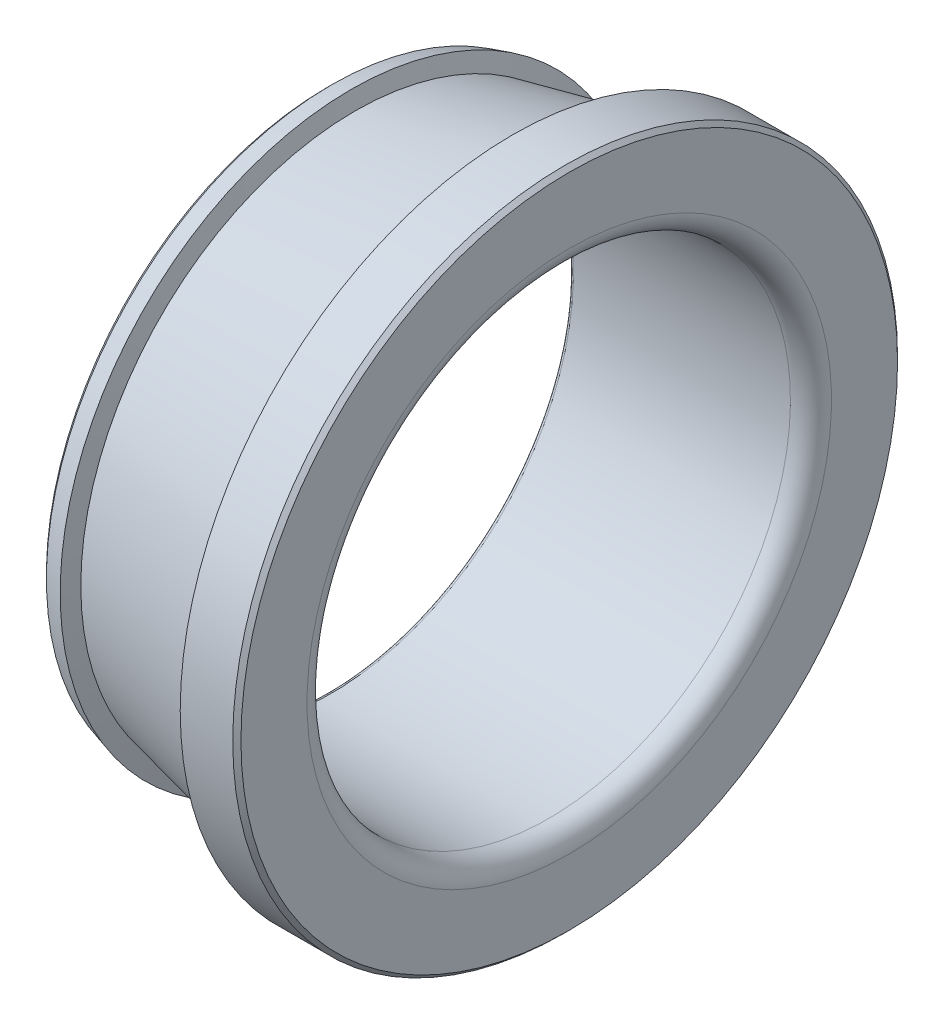
ISO-10303-21;
HEADER;
FILE_DESCRIPTION(('STEP AP214'),'2;1');
FILE_NAME('part.step','',(''),(''),'','','');
FILE_SCHEMA(('AUTOMOTIVE_DESIGN { 1 0 10303 214 1 1 1 1 }'));
ENDSEC;
DATA;
#1=APPLICATION_CONTEXT('core data for automotive mechanical design processes');
#2=APPLICATION_PROTOCOL_DEFINITION('international standard','automotive_design',2000,#1);
#3=PRODUCT_CONTEXT('',#1,'mechanical');
#4=PRODUCT('Part','Part','',(#3));
#5=PRODUCT_RELATED_PRODUCT_CATEGORY('part','',(#4));
#6=PRODUCT_DEFINITION_FORMATION('','',#4);
#7=PRODUCT_DEFINITION_CONTEXT('part definition',#1,'design');
#8=PRODUCT_DEFINITION('design','',#6,#7);
#9=PRODUCT_DEFINITION_SHAPE('','',#8);
#10=(LENGTH_UNIT() NAMED_UNIT(*) SI_UNIT(.MILLI.,.METRE.));
#11=(NAMED_UNIT(*) PLANE_ANGLE_UNIT() SI_UNIT($,.RADIAN.));
#12=(NAMED_UNIT(*) SI_UNIT($,.STERADIAN.) SOLID_ANGLE_UNIT());
#13=UNCERTAINTY_MEASURE_WITH_UNIT(LENGTH_MEASURE(1.E-05),#10,'distance_accuracy_value','');
#14=(GEOMETRIC_REPRESENTATION_CONTEXT(3) GLOBAL_UNCERTAINTY_ASSIGNED_CONTEXT((#13)) GLOBAL_UNIT_ASSIGNED_CONTEXT((#10,
#11,#12)) REPRESENTATION_CONTEXT('',''));
#15=CARTESIAN_POINT('',(0.,0.,0.));
#16=DIRECTION('',(0.,0.,1.));
#17=DIRECTION('',(1.,0.,0.));
#18=AXIS2_PLACEMENT_3D('',#15,#16,#17);
#19=CARTESIAN_POINT('',(14.6375,0.,0.));
#20=DIRECTION('',(1.,0.,0.));
#21=DIRECTION('',(0.,1.,0.));
#22=AXIS2_PLACEMENT_3D('',#19,#20,#21);
#23=CONICAL_SURFACE('',#22,52.72875,0.281388552797828);
#24=CARTESIAN_POINT('',(0.7,0.,0.));
#25=DIRECTION('',(1.,0.,0.));
#26=DIRECTION('',(0.,1.,0.));
#27=AXIS2_PLACEMENT_3D('',#24,#25,#26);
#28=CIRCLE('',#27,48.7);
#29=CARTESIAN_POINT('',(0.7,48.7,0.));
#30=VERTEX_POINT('',#29);
#31=EDGE_CURVE('E11',#30,#30,#28,.T.);
#32=ORIENTED_EDGE('',*,*,#31,.T.);
#33=EDGE_LOOP('',(#32));
#34=FACE_BOUND('',#33,.T.);
#35=CARTESIAN_POINT('',(4.00126844537017,0.,0.));
#36=DIRECTION('',(-1.,0.,0.));
#37=DIRECTION('',(0.,1.,0.));
#38=AXIS2_PLACEMENT_3D('',#35,#36,#37);
#39=CIRCLE('',#38,49.6542590313389);
#40=CARTESIAN_POINT('',(4.00126844537017,-49.6542590313389,0.));
#41=VERTEX_POINT('',#40);
#42=EDGE_CURVE('E44',#41,#41,#39,.T.);
#43=ORIENTED_EDGE('',*,*,#42,.T.);
#44=EDGE_LOOP('',(#43));
#45=FACE_BOUND('',#44,.T.);
#46=ADVANCED_FACE('F17',(#34,#45),#23,.T.);
#47=CARTESIAN_POINT('',(0.35,0.,0.));
#48=DIRECTION('',(1.,0.,0.));
#49=DIRECTION('',(0.,1.,0.));
#50=AXIS2_PLACEMENT_3D('',#47,#48,#49);
#51=CONICAL_SURFACE('',#50,48.35,0.78539816339745);
#52=CARTESIAN_POINT('',(0.,0.,0.));
#53=DIRECTION('',(1.,0.,0.));
#54=DIRECTION('',(0.,1.,0.));
#55=AXIS2_PLACEMENT_3D('',#52,#53,#54);
#56=CIRCLE('',#55,48.);
#57=CARTESIAN_POINT('',(0.,48.,0.));
#58=VERTEX_POINT('',#57);
#59=EDGE_CURVE('E26',#58,#58,#56,.T.);
#60=ORIENTED_EDGE('',*,*,#59,.T.);
#61=EDGE_LOOP('',(#60));
#62=FACE_BOUND('',#61,.T.);
#63=ORIENTED_EDGE('',*,*,#31,.F.);
#64=EDGE_LOOP('',(#63));
#65=FACE_BOUND('',#64,.T.);
#66=ADVANCED_FACE('F112',(#62,#65),#51,.T.);
#67=CARTESIAN_POINT('',(0.,44.9875,0.));
#68=DIRECTION('',(-1.,0.,0.));
#69=DIRECTION('',(0.,-1.,0.));
#70=AXIS2_PLACEMENT_3D('',#67,#68,#69);
#71=PLANE('',#70);
#72=CARTESIAN_POINT('',(0.,0.,0.));
#73=DIRECTION('',(1.,0.,0.));
#74=DIRECTION('',(0.,1.,0.));
#75=AXIS2_PLACEMENT_3D('',#72,#73,#74);
#76=CIRCLE('',#75,41.975);
#77=CARTESIAN_POINT('',(0.,41.975,0.));
#78=VERTEX_POINT('',#77);
#79=EDGE_CURVE('E76',#78,#78,#76,.T.);
#80=ORIENTED_EDGE('',*,*,#79,.T.);
#81=EDGE_LOOP('',(#80));
#82=FACE_BOUND('',#81,.T.);
#83=ORIENTED_EDGE('',*,*,#59,.F.);
#84=EDGE_LOOP('',(#83));
#85=FACE_BOUND('',#84,.T.);
#86=ADVANCED_FACE('F116',(#82,#85),#71,.T.);
#87=CARTESIAN_POINT('',(0.7,0.,0.));
#88=DIRECTION('',(1.,0.,0.));
#89=DIRECTION('',(0.,0.,-1.));
#90=AXIS2_PLACEMENT_3D('',#87,#88,#89);
#91=TOROIDAL_SURFACE('',#90,41.975,0.7);
#92=CARTESIAN_POINT('',(0.7,0.,0.));
#93=DIRECTION('',(1.,0.,0.));
#94=DIRECTION('',(0.,1.,0.));
#95=AXIS2_PLACEMENT_3D('',#92,#93,#94);
#96=CIRCLE('',#95,41.275);
#97=CARTESIAN_POINT('',(0.7,41.275,0.));
#98=VERTEX_POINT('',#97);
#99=EDGE_CURVE('E67',#98,#98,#96,.T.);
#100=ORIENTED_EDGE('',*,*,#99,.T.);
#101=EDGE_LOOP('',(#100));
#102=FACE_BOUND('',#101,.T.);
#103=ORIENTED_EDGE('',*,*,#79,.F.);
#104=EDGE_LOOP('',(#103));
#105=FACE_BOUND('',#104,.T.);
#106=ADVANCED_FACE('F122',(#102,#105),#91,.T.);
#107=CARTESIAN_POINT('',(19.2375,0.,0.));
#108=DIRECTION('',(-1.,0.,0.));
#109=DIRECTION('',(0.,1.,0.));
#110=AXIS2_PLACEMENT_3D('',#107,#108,#109);
#111=CYLINDRICAL_SURFACE('',#110,41.275);
#112=CARTESIAN_POINT('',(37.775,0.,0.));
#113=DIRECTION('',(1.,0.,0.));
#114=DIRECTION('',(0.,1.,0.));
#115=AXIS2_PLACEMENT_3D('',#112,#113,#114);
#116=CIRCLE('',#115,41.275);
#117=CARTESIAN_POINT('',(37.775,41.275,0.));
#118=VERTEX_POINT('',#117);
#119=EDGE_CURVE('E71',#118,#118,#116,.T.);
#120=ORIENTED_EDGE('',*,*,#119,.T.);
#121=EDGE_LOOP('',(#120));
#122=FACE_BOUND('',#121,.T.);
#123=ORIENTED_EDGE('',*,*,#99,.F.);
#124=EDGE_LOOP('',(#123));
#125=FACE_BOUND('',#124,.T.);
#126=ADVANCED_FACE('F72',(#122,#125),#111,.F.);
#127=CARTESIAN_POINT('',(37.775,0.,0.));
#128=DIRECTION('',(1.,0.,0.));
#129=DIRECTION('',(0.,0.,-1.));
#130=AXIS2_PLACEMENT_3D('',#127,#128,#129);
#131=TOROIDAL_SURFACE('',#130,44.775,3.5);
#132=CARTESIAN_POINT('',(41.275,0.,0.));
#133=DIRECTION('',(1.,0.,0.));
#134=DIRECTION('',(0.,1.,0.));
#135=AXIS2_PLACEMENT_3D('',#132,#133,#134);
#136=CIRCLE('',#135,44.775);
#137=CARTESIAN_POINT('',(41.275,44.775,0.));
#138=VERTEX_POINT('',#137);
#139=EDGE_CURVE('E75',#138,#138,#136,.T.);
#140=ORIENTED_EDGE('',*,*,#139,.T.);
#141=EDGE_LOOP('',(#140));
#142=FACE_BOUND('',#141,.T.);
#143=ORIENTED_EDGE('',*,*,#119,.F.);
#144=EDGE_LOOP('',(#143));
#145=FACE_BOUND('',#144,.T.);
#146=ADVANCED_FACE('F108',(#142,#145),#131,.T.);
#147=CARTESIAN_POINT('',(41.275,50.41625,0.));
#148=DIRECTION('',(1.,0.,0.));
#149=DIRECTION('',(0.,1.,0.));
#150=AXIS2_PLACEMENT_3D('',#147,#148,#149);
#151=PLANE('',#150);
#152=CARTESIAN_POINT('',(41.275,0.,0.));
#153=DIRECTION('',(1.,0.,0.));
#154=DIRECTION('',(0.,1.,0.));
#155=AXIS2_PLACEMENT_3D('',#152,#153,#154);
#156=CIRCLE('',#155,56.0575);
#157=CARTESIAN_POINT('',(41.275,56.0575,0.));
#158=VERTEX_POINT('',#157);
#159=EDGE_CURVE('E78',#158,#158,#156,.T.);
#160=ORIENTED_EDGE('',*,*,#159,.T.);
#161=EDGE_LOOP('',(#160));
#162=FACE_BOUND('',#161,.T.);
#163=ORIENTED_EDGE('',*,*,#139,.F.);
#164=EDGE_LOOP('',(#163));
#165=FACE_BOUND('',#164,.T.);
#166=ADVANCED_FACE('F92',(#162,#165),#151,.T.);
#167=CARTESIAN_POINT('',(40.925,0.,0.));
#168=DIRECTION('',(-1.,0.,0.));
#169=DIRECTION('',(0.,1.,0.));
#170=AXIS2_PLACEMENT_3D('',#167,#168,#169);
#171=CONICAL_SURFACE('',#170,56.4075,0.785398163397448);
#172=CARTESIAN_POINT('',(40.575,0.,0.));
#173=DIRECTION('',(1.,0.,0.));
#174=DIRECTION('',(0.,1.,0.));
#175=AXIS2_PLACEMENT_3D('',#172,#173,#174);
#176=CIRCLE('',#175,56.7575);
#177=CARTESIAN_POINT('',(40.575,56.7575,0.));
#178=VERTEX_POINT('',#177);
#179=EDGE_CURVE('E84',#178,#178,#176,.T.);
#180=ORIENTED_EDGE('',*,*,#179,.T.);
#181=EDGE_LOOP('',(#180));
#182=FACE_BOUND('',#181,.T.);
#183=ORIENTED_EDGE('',*,*,#159,.F.);
#184=EDGE_LOOP('',(#183));
#185=FACE_BOUND('',#184,.T.);
#186=ADVANCED_FACE('F95',(#182,#185),#171,.T.);
#187=CARTESIAN_POINT('',(34.575,0.,0.));
#188=DIRECTION('',(-1.,0.,0.));
#189=DIRECTION('',(0.,1.,0.));
#190=AXIS2_PLACEMENT_3D('',#187,#188,#189);
#191=CYLINDRICAL_SURFACE('',#190,56.7575);
#192=ORIENTED_EDGE('',*,*,#179,.F.);
#193=EDGE_LOOP('',(#192));
#194=FACE_BOUND('',#193,.T.);
#195=CARTESIAN_POINT('',(31.6041194259764,0.,0.));
#196=DIRECTION('',(1.,0.,0.));
#197=DIRECTION('',(0.,1.,0.));
#198=AXIS2_PLACEMENT_3D('',#195,#196,#197);
#199=CIRCLE('',#198,56.7575);
#200=CARTESIAN_POINT('',(31.6041194259764,-56.7575,0.));
#201=VERTEX_POINT('',#200);
#202=EDGE_CURVE('E82',#201,#201,#199,.T.);
#203=ORIENTED_EDGE('',*,*,#202,.T.);
#204=EDGE_LOOP('',(#203));
#205=FACE_BOUND('',#204,.T.);
#206=ADVANCED_FACE('F97',(#194,#205),#191,.T.);
#207=CARTESIAN_POINT('',(30.6762706178788,0.,0.));
#208=DIRECTION('',(-1.,0.,0.));
#209=DIRECTION('',(0.,1.,0.));
#210=AXIS2_PLACEMENT_3D('',#207,#208,#209);
#211=CONICAL_SURFACE('',#210,60.5564840953873,1.33124988695867);
#212=CARTESIAN_POINT('',(32.5597753365617,0.,0.));
#213=DIRECTION('',(1.,0.,0.));
#214=DIRECTION('',(0.,1.,0.));
#215=AXIS2_PLACEMENT_3D('',#212,#213,#214);
#216=CIRCLE('',#215,52.8446625061194);
#217=CARTESIAN_POINT('',(32.5597753365617,52.8446625061194,0.));
#218=VERTEX_POINT('',#217);
#219=EDGE_CURVE('E51',#218,#218,#216,.T.);
#220=ORIENTED_EDGE('',*,*,#219,.T.);
#221=EDGE_LOOP('',(#220));
#222=FACE_BOUND('',#221,.T.);
#223=ORIENTED_EDGE('',*,*,#202,.F.);
#224=EDGE_LOOP('',(#223));
#225=FACE_BOUND('',#224,.T.);
#226=ADVANCED_FACE('F105',(#222,#225),#211,.F.);
#227=CARTESIAN_POINT('',(2.99006852754231,0.,0.));
#228=DIRECTION('',(-1.,0.,0.));
#229=DIRECTION('',(0.,1.,0.));
#230=AXIS2_PLACEMENT_3D('',#227,#228,#229);
#231=CONICAL_SURFACE('',#230,53.7945159046127,1.33124988695867);
#232=CARTESIAN_POINT('',(4.69355235524369,0.,0.));
#233=DIRECTION('',(1.,0.,0.));
#234=DIRECTION('',(0.,1.,0.));
#235=AXIS2_PLACEMENT_3D('',#232,#233,#234);
#236=CIRCLE('',#235,46.819771838868);
#237=CARTESIAN_POINT('',(4.69355235524369,46.819771838868,0.));
#238=VERTEX_POINT('',#237);
#239=EDGE_CURVE('E20',#238,#238,#236,.T.);
#240=ORIENTED_EDGE('',*,*,#239,.F.);
#241=EDGE_LOOP('',(#240));
#242=FACE_BOUND('',#241,.T.);
#243=ORIENTED_EDGE('',*,*,#42,.F.);
#244=EDGE_LOOP('',(#243));
#245=FACE_BOUND('',#244,.T.);
#246=ADVANCED_FACE('F141',(#242,#245),#231,.T.);
#247=CARTESIAN_POINT('',(18.6266638459027,0.,0.));
#248=DIRECTION('',(1.,0.,0.));
#249=DIRECTION('',(0.,1.,0.));
#250=AXIS2_PLACEMENT_3D('',#247,#248,#249);
#251=CONICAL_SURFACE('',#250,49.8322171724937,0.212930168743309);
#252=ORIENTED_EDGE('',*,*,#219,.F.);
#253=EDGE_LOOP('',(#252));
#254=FACE_BOUND('',#253,.T.);
#255=ORIENTED_EDGE('',*,*,#239,.T.);
#256=EDGE_LOOP('',(#255));
#257=FACE_BOUND('',#256,.T.);
#258=ADVANCED_FACE('F138',(#254,#257),#251,.T.);
#259=CLOSED_SHELL('',(#46,#66,#86,#106,#126,#146,#166,#186,#206,#226,#246,#258));
#260=MANIFOLD_SOLID_BREP('B1',#259);
#261=ADVANCED_BREP_SHAPE_REPRESENTATION('',(#18,#260),#14);
#262=SHAPE_DEFINITION_REPRESENTATION(#9,#261);
ENDSEC;
END-ISO-10303-21;
